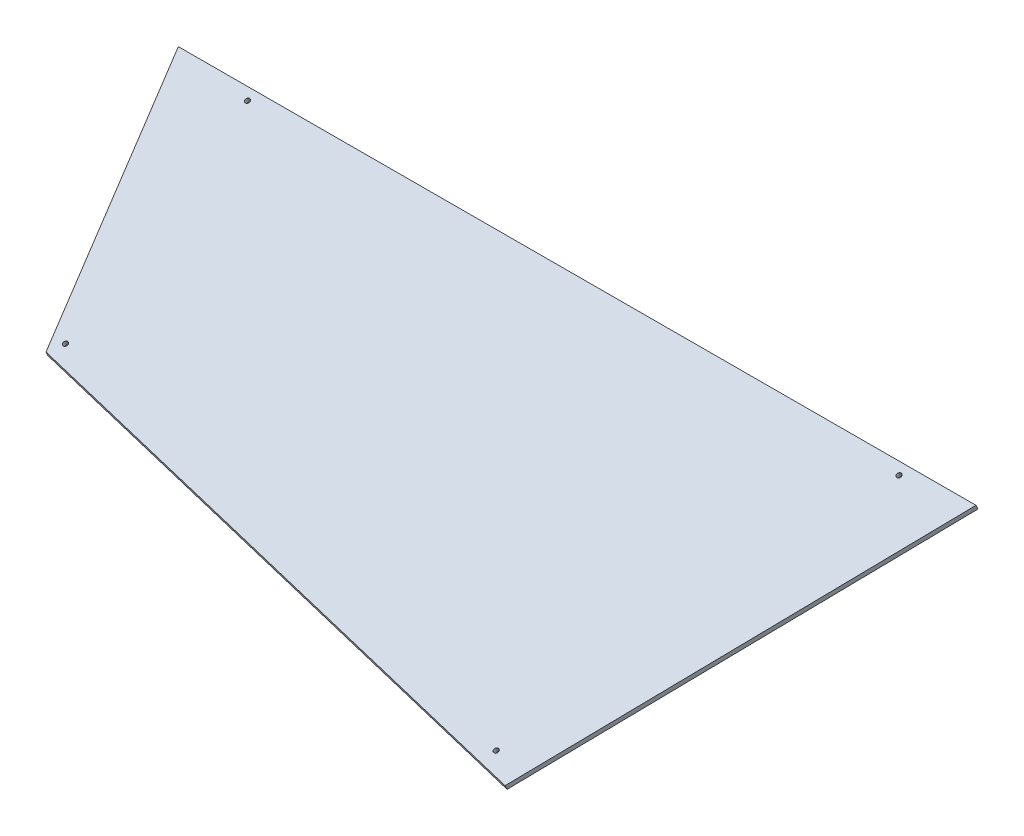
ISO-10303-21;
HEADER;
FILE_DESCRIPTION(('STEP AP214'),'2;1');
FILE_NAME('part.step','',(''),(''),'','','');
FILE_SCHEMA(('AUTOMOTIVE_DESIGN { 1 0 10303 214 1 1 1 1 }'));
ENDSEC;
DATA;
#1=APPLICATION_CONTEXT('core data for automotive mechanical design processes');
#2=APPLICATION_PROTOCOL_DEFINITION('international standard','automotive_design',2000,#1);
#3=PRODUCT_CONTEXT('',#1,'mechanical');
#4=PRODUCT('Part','Part','',(#3));
#5=PRODUCT_RELATED_PRODUCT_CATEGORY('part','',(#4));
#6=PRODUCT_DEFINITION_FORMATION('','',#4);
#7=PRODUCT_DEFINITION_CONTEXT('part definition',#1,'design');
#8=PRODUCT_DEFINITION('design','',#6,#7);
#9=PRODUCT_DEFINITION_SHAPE('','',#8);
#10=(LENGTH_UNIT() NAMED_UNIT(*) SI_UNIT(.MILLI.,.METRE.));
#11=(NAMED_UNIT(*) PLANE_ANGLE_UNIT() SI_UNIT($,.RADIAN.));
#12=(NAMED_UNIT(*) SI_UNIT($,.STERADIAN.) SOLID_ANGLE_UNIT());
#13=UNCERTAINTY_MEASURE_WITH_UNIT(LENGTH_MEASURE(1.E-05),#10,'distance_accuracy_value','');
#14=(GEOMETRIC_REPRESENTATION_CONTEXT(3) GLOBAL_UNCERTAINTY_ASSIGNED_CONTEXT((#13)) GLOBAL_UNIT_ASSIGNED_CONTEXT((#10,
#11,#12)) REPRESENTATION_CONTEXT('',''));
#15=CARTESIAN_POINT('',(0.,0.,0.));
#16=DIRECTION('',(0.,0.,1.));
#17=DIRECTION('',(1.,0.,0.));
#18=AXIS2_PLACEMENT_3D('',#15,#16,#17);
#19=CARTESIAN_POINT('',(-0.00358139259848318,-2107.78023965512,1619.03143783743));
#20=DIRECTION('',(0.00422190853313018,-0.906095441193539,-0.423052274472818));
#21=DIRECTION('',(0.,0.423056044873322,-0.906103516655874));
#22=AXIS2_PLACEMENT_3D('',#19,#20,#21);
#23=PLANE('',#22);
#24=CARTESIAN_POINT('',(-438.261076907726,-2011.60885587052,1408.67744413458));
#25=DIRECTION('',(0.00422190853313018,-0.906095441193539,-0.423052274472818));
#26=DIRECTION('',(0.,0.423056044873322,-0.906103516655874));
#27=AXIS2_PLACEMENT_3D('',#24,#25,#26);
#28=CIRCLE('',#27,3.175);
#29=CARTESIAN_POINT('',(-438.261076907726,-2010.26565292805,1405.8005654692));
#30=VERTEX_POINT('',#29);
#31=EDGE_CURVE('E109',#30,#30,#28,.F.);
#32=ORIENTED_EDGE('',*,*,#31,.T.);
#33=EDGE_LOOP('',(#32));
#34=FACE_BOUND('',#33,.T.);
#35=CARTESIAN_POINT('',(309.868495869838,-2199.30960250355,1818.16188828813));
#36=DIRECTION('',(0.00422190853313018,-0.906095441193539,-0.423052274472818));
#37=DIRECTION('',(0.,0.423056044873322,-0.906103516655874));
#38=AXIS2_PLACEMENT_3D('',#35,#36,#37);
#39=CIRCLE('',#38,3.175);
#40=CARTESIAN_POINT('',(309.868495869838,-2197.96639956107,1815.28500962275));
#41=VERTEX_POINT('',#40);
#42=EDGE_CURVE('E114',#41,#41,#39,.F.);
#43=ORIENTED_EDGE('',*,*,#42,.T.);
#44=EDGE_LOOP('',(#43));
#45=FACE_BOUND('',#44,.T.);
#46=CARTESIAN_POINT('',(-406.222072695858,-2142.2149967263,1688.73005634293));
#47=DIRECTION('',(0.00422190853313018,-0.906095441193539,-0.423052274472818));
#48=DIRECTION('',(0.,0.423056044873322,-0.906103516655874));
#49=AXIS2_PLACEMENT_3D('',#46,#47,#48);
#50=CIRCLE('',#49,3.175);
#51=CARTESIAN_POINT('',(-406.222072695858,-2140.87179378382,1685.85317767755));
#52=VERTEX_POINT('',#51);
#53=EDGE_CURVE('E117',#52,#52,#50,.F.);
#54=ORIENTED_EDGE('',*,*,#53,.T.);
#55=EDGE_LOOP('',(#54));
#56=FACE_BOUND('',#55,.T.);
#57=CARTESIAN_POINT('',(450.723077101153,-2008.20802897601,1410.26527637322));
#58=DIRECTION('',(0.00422190853313018,-0.906095441193539,-0.423052274472818));
#59=DIRECTION('',(0.,0.423056044873322,-0.906103516655874));
#60=AXIS2_PLACEMENT_3D('',#57,#58,#59);
#61=CIRCLE('',#60,3.175);
#62=CARTESIAN_POINT('',(450.723077101153,-2006.86482603354,1407.38839770784));
#63=VERTEX_POINT('',#62);
#64=EDGE_CURVE('E120',#63,#63,#61,.F.);
#65=ORIENTED_EDGE('',*,*,#64,.T.);
#66=EDGE_LOOP('',(#65));
#67=FACE_BOUND('',#66,.T.);
#68=DIRECTION('',(0.981039789113387,-0.0782192678831477,0.177320834388361));
#69=VECTOR('',#68,1.);
#70=CARTESIAN_POINT('',(-417.050544863239,-2149.56653408571,1704.36755096701));
#71=LINE('',#70,#69);
#72=CARTESIAN_POINT('',(346.206371306398,-2210.42175917652,1842.32459891733));
#73=VERTEX_POINT('',#72);
#74=CARTESIAN_POINT('',(-417.044175234292,-2149.5670419425,1704.36870226376));
#75=VERTEX_POINT('',#74);
#76=EDGE_CURVE('E65',#73,#75,#71,.F.);
#77=ORIENTED_EDGE('',*,*,#76,.T.);
#78=DIRECTION('',(0.351213362969676,-0.394761380239892,0.849006847052853));
#79=VECTOR('',#78,1.);
#80=CARTESIAN_POINT('',(-544.203988770672,-2006.6402948557,1396.9784838236));
#81=LINE('',#80,#79);
#82=CARTESIAN_POINT('',(-544.203070163425,-2006.64132736387,1396.98070442203));
#83=VERTEX_POINT('',#82);
#84=EDGE_CURVE('E20',#75,#83,#81,.F.);
#85=ORIENTED_EDGE('',*,*,#84,.T.);
#86=DIRECTION('',(0.999991087704454,0.0038254861688687,0.00178610392584298));
#87=VECTOR('',#86,1.);
#88=CARTESIAN_POINT('',(-0.00358139259848318,-2004.55948119244,1397.95270992817));
#89=LINE('',#88,#87);
#90=CARTESIAN_POINT('',(544.181416145958,-2002.47817600506,1398.92572949959));
#91=VERTEX_POINT('',#90);
#92=EDGE_CURVE('E63',#83,#91,#89,.T.);
#93=ORIENTED_EDGE('',*,*,#92,.T.);
#94=DIRECTION('',(0.374785223744526,0.393653370611545,-0.839388503536315));
#95=VECTOR('',#94,1.);
#96=CARTESIAN_POINT('',(346.205887927682,-2210.42226689041,1842.32568151748));
#97=LINE('',#96,#95);
#98=EDGE_CURVE('E70',#91,#73,#97,.F.);
#99=ORIENTED_EDGE('',*,*,#98,.T.);
#100=EDGE_LOOP('',(#77,#85,#93,#99));
#101=FACE_BOUND('',#100,.T.);
#102=ADVANCED_FACE('F17',(#34,#45,#56,#67,#101),#23,.T.);
#103=CARTESIAN_POINT('',(-470.450893623128,-2083.81468868055,1578.01697448958));
#104=DIRECTION('',(0.936285933441205,0.152166041281801,-0.316566180633302));
#105=DIRECTION('',(-0.320296045935456,0.,-0.947317498496736));
#106=AXIS2_PLACEMENT_3D('',#103,#104,#105);
#107=PLANE('',#106);
#108=DIRECTION('',(0.351213362969675,-0.394761380239891,0.849006847052853));
#109=VECTOR('',#108,1.);
#110=CARTESIAN_POINT('',(-544.228960675439,-2000.88865382032,1399.66930696321));
#111=LINE('',#110,#109);
#112=CARTESIAN_POINT('',(-417.070984353477,-2143.81333589087,1707.05508420669));
#113=VERTEX_POINT('',#112);
#114=CARTESIAN_POINT('',(-544.226382306554,-2000.88812884747,1399.6682083049));
#115=VERTEX_POINT('',#114);
#116=EDGE_CURVE('E102',#113,#115,#111,.F.);
#117=ORIENTED_EDGE('',*,*,#116,.T.);
#118=DIRECTION('',(0.00422190853311099,-0.906095441193552,-0.42305227447279));
#119=VECTOR('',#118,1.);
#120=CARTESIAN_POINT('',(-544.229879282611,-2000.88762131225,1399.66708636496));
#121=LINE('',#120,#119);
#122=EDGE_CURVE('E59',#115,#83,#121,.T.);
#123=ORIENTED_EDGE('',*,*,#122,.T.);
#124=ORIENTED_EDGE('',*,*,#84,.F.);
#125=DIRECTION('',(-0.00422190853308475,0.906095441193522,0.423052274472853));
#126=VECTOR('',#125,1.);
#127=CARTESIAN_POINT('',(-417.070984353477,-2143.81333589088,1707.05508420668));
#128=LINE('',#127,#126);
#129=EDGE_CURVE('E57',#75,#113,#128,.T.);
#130=ORIENTED_EDGE('',*,*,#129,.T.);
#131=EDGE_LOOP('',(#117,#123,#124,#130));
#132=FACE_BOUND('',#131,.T.);
#133=ADVANCED_FACE('F56',(#132),#107,.F.);
#134=CARTESIAN_POINT('',(-36.7692399542864,-1998.94632035387,1400.57347188301));
#135=DIRECTION('',(0.,-0.423056044873294,0.906103516655887));
#136=DIRECTION('',(0.,-0.906103516655887,-0.423056044873294));
#137=AXIS2_PLACEMENT_3D('',#134,#135,#136);
#138=PLANE('',#137);
#139=DIRECTION('',(-0.999991087704454,-0.00382548616886864,-0.00178610392584284));
#140=VECTOR('',#139,1.);
#141=CARTESIAN_POINT('',(544.160305703339,-1996.72396260549,1401.61108167267));
#142=LINE('',#141,#140);
#143=CARTESIAN_POINT('',(544.156699280931,-1996.72397640193,1401.61107523117));
#144=VERTEX_POINT('',#143);
#145=EDGE_CURVE('E91',#115,#144,#142,.F.);
#146=ORIENTED_EDGE('',*,*,#145,.T.);
#147=DIRECTION('',(0.0042219085331533,-0.906095441193552,-0.42305227447279));
#148=VECTOR('',#147,1.);
#149=CARTESIAN_POINT('',(544.156699280931,-1996.72397640199,1401.61107523114));
#150=LINE('',#149,#148);
#151=EDGE_CURVE('E71',#144,#91,#150,.T.);
#152=ORIENTED_EDGE('',*,*,#151,.T.);
#153=ORIENTED_EDGE('',*,*,#92,.F.);
#154=ORIENTED_EDGE('',*,*,#122,.F.);
#155=EDGE_LOOP('',(#146,#152,#153,#154));
#156=FACE_BOUND('',#155,.T.);
#157=ADVANCED_FACE('F89',(#156),#138,.F.);
#158=CARTESIAN_POINT('',(424.551166269604,-2122.3509174624,1669.48585526113));
#159=DIRECTION('',(-0.927102050235627,0.155009919858205,-0.34125315118611));
#160=DIRECTION('',(-0.345428373804897,0.,0.938445117505816));
#161=AXIS2_PLACEMENT_3D('',#158,#159,#160);
#162=PLANE('',#161);
#163=DIRECTION('',(0.374785223744526,0.393653370611546,-0.839388503536315));
#164=VECTOR('',#163,1.);
#165=CARTESIAN_POINT('',(346.180045565917,-2204.66754541103,1845.00989826014));
#166=LINE('',#165,#164);
#167=CARTESIAN_POINT('',(346.179562187212,-2204.66805312489,1845.01098086026));
#168=VERTEX_POINT('',#167);
#169=EDGE_CURVE('E96',#144,#168,#166,.F.);
#170=ORIENTED_EDGE('',*,*,#169,.T.);
#171=DIRECTION('',(0.0042219085331744,-0.906095441193529,-0.423052274472837));
#172=VECTOR('',#171,1.);
#173=CARTESIAN_POINT('',(346.179562187212,-2204.66805312487,1845.01098086027));
#174=LINE('',#173,#172);
#175=EDGE_CURVE('E35',#168,#73,#174,.T.);
#176=ORIENTED_EDGE('',*,*,#175,.T.);
#177=ORIENTED_EDGE('',*,*,#98,.F.);
#178=ORIENTED_EDGE('',*,*,#151,.F.);
#179=EDGE_LOOP('',(#170,#176,#177,#178));
#180=FACE_BOUND('',#179,.T.);
#181=ADVANCED_FACE('F95',(#180),#162,.F.);
#182=CARTESIAN_POINT('',(-28.1216276110646,-2174.82465089115,1777.35684488728));
#183=DIRECTION('',(0.193760438853493,0.415779746476585,-0.888585445950567));
#184=DIRECTION('',(0.,0.905750436995009,0.423811450863883));
#185=AXIS2_PLACEMENT_3D('',#182,#183,#184);
#186=PLANE('',#185);
#187=DIRECTION('',(0.981039789113387,-0.0782192678831483,0.177320834388361));
#188=VECTOR('',#187,1.);
#189=CARTESIAN_POINT('',(-417.064614724072,-2143.81384374769,1707.05623550352));
#190=LINE('',#189,#188);
#191=EDGE_CURVE('E67',#168,#113,#190,.F.);
#192=ORIENTED_EDGE('',*,*,#191,.T.);
#193=ORIENTED_EDGE('',*,*,#129,.F.);
#194=ORIENTED_EDGE('',*,*,#76,.F.);
#195=ORIENTED_EDGE('',*,*,#175,.F.);
#196=EDGE_LOOP('',(#192,#193,#194,#195));
#197=FACE_BOUND('',#196,.T.);
#198=ADVANCED_FACE('F64',(#197),#186,.F.);
#199=CARTESIAN_POINT('',(2782.92716822902,-502540.012145804,-232285.997336627));
#200=DIRECTION('',(0.00422190853313018,-0.906095441193539,-0.423052274472818));
#201=DIRECTION('',(0.,0.423056044873322,-0.906103516655874));
#202=AXIS2_PLACEMENT_3D('',#199,#200,#201);
#203=CYLINDRICAL_SURFACE('',#202,3.175);
#204=CARTESIAN_POINT('',(450.696267981967,-2002.45432292422,1412.95165831622));
#205=DIRECTION('',(0.00422190853313018,-0.906095441193539,-0.423052274472818));
#206=DIRECTION('',(0.,0.423056044873322,-0.906103516655874));
#207=AXIS2_PLACEMENT_3D('',#204,#205,#206);
#208=CIRCLE('',#207,3.175);
#209=CARTESIAN_POINT('',(450.696267981967,-2001.11111998175,1410.07477965083));
#210=VERTEX_POINT('',#209);
#211=EDGE_CURVE('E100',#210,#210,#208,.F.);
#212=ORIENTED_EDGE('',*,*,#211,.T.);
#213=EDGE_LOOP('',(#212));
#214=FACE_BOUND('',#213,.T.);
#215=ORIENTED_EDGE('',*,*,#64,.F.);
#216=EDGE_LOOP('',(#215));
#217=FACE_BOUND('',#216,.T.);
#218=ADVANCED_FACE('F125',(#214,#217),#203,.F.);
#219=CARTESIAN_POINT('',(1925.35761936063,-502540.012147836,-231944.965249655));
#220=DIRECTION('',(0.00422190853313018,-0.906095441193539,-0.423052274472818));
#221=DIRECTION('',(0.,0.423056044873322,-0.906103516655874));
#222=AXIS2_PLACEMENT_3D('',#219,#220,#221);
#223=CYLINDRICAL_SURFACE('',#222,3.175);
#224=CARTESIAN_POINT('',(-406.248881815043,-2136.46129067479,1691.41643828578));
#225=DIRECTION('',(0.00422190853313018,-0.906095441193539,-0.423052274472818));
#226=DIRECTION('',(0.,0.423056044873322,-0.906103516655874));
#227=AXIS2_PLACEMENT_3D('',#224,#225,#226);
#228=CIRCLE('',#227,3.175);
#229=CARTESIAN_POINT('',(-406.248881815043,-2135.11808773231,1688.5395596204));
#230=VERTEX_POINT('',#229);
#231=EDGE_CURVE('E234',#230,#230,#228,.F.);
#232=ORIENTED_EDGE('',*,*,#231,.T.);
#233=EDGE_LOOP('',(#232));
#234=FACE_BOUND('',#233,.T.);
#235=ORIENTED_EDGE('',*,*,#53,.F.);
#236=EDGE_LOOP('',(#235));
#237=FACE_BOUND('',#236,.T.);
#238=ADVANCED_FACE('F127',(#234,#237),#223,.F.);
#239=CARTESIAN_POINT('',(2641.18215833124,-502540.012147836,-231788.876178598));
#240=DIRECTION('',(0.00422190853313018,-0.906095441193539,-0.423052274472818));
#241=DIRECTION('',(0.,0.423056044873322,-0.906103516655874));
#242=AXIS2_PLACEMENT_3D('',#239,#240,#241);
#243=CYLINDRICAL_SURFACE('',#242,3.175);
#244=CARTESIAN_POINT('',(309.841686750653,-2193.5558964521,1820.84827023098));
#245=DIRECTION('',(0.00422190853313018,-0.906095441193539,-0.423052274472818));
#246=DIRECTION('',(0.,0.423056044873322,-0.906103516655874));
#247=AXIS2_PLACEMENT_3D('',#244,#245,#246);
#248=CIRCLE('',#247,3.175);
#249=CARTESIAN_POINT('',(309.841686750653,-2192.21269350962,1817.9713915656));
#250=VERTEX_POINT('',#249);
#251=EDGE_CURVE('E26',#250,#250,#248,.F.);
#252=ORIENTED_EDGE('',*,*,#251,.T.);
#253=EDGE_LOOP('',(#252));
#254=FACE_BOUND('',#253,.T.);
#255=ORIENTED_EDGE('',*,*,#42,.F.);
#256=EDGE_LOOP('',(#255));
#257=FACE_BOUND('',#256,.T.);
#258=ADVANCED_FACE('F135',(#254,#257),#243,.F.);
#259=CARTESIAN_POINT('',(1893.92716822927,-502540.012145804,-232285.997336627));
#260=DIRECTION('',(0.00422190853313018,-0.906095441193539,-0.423052274472818));
#261=DIRECTION('',(0.,0.423056044873322,-0.906103516655874));
#262=AXIS2_PLACEMENT_3D('',#259,#260,#261);
#263=CYLINDRICAL_SURFACE('',#262,3.175);
#264=CARTESIAN_POINT('',(-438.287886026909,-2005.85514981924,1411.36382607735));
#265=DIRECTION('',(0.00422190853313018,-0.906095441193539,-0.423052274472818));
#266=DIRECTION('',(0.,0.423056044873322,-0.906103516655874));
#267=AXIS2_PLACEMENT_3D('',#264,#265,#266);
#268=CIRCLE('',#267,3.175);
#269=CARTESIAN_POINT('',(-438.287886026909,-2004.51194687677,1408.48694741197));
#270=VERTEX_POINT('',#269);
#271=EDGE_CURVE('E11',#270,#270,#268,.F.);
#272=ORIENTED_EDGE('',*,*,#271,.T.);
#273=EDGE_LOOP('',(#272));
#274=FACE_BOUND('',#273,.T.);
#275=ORIENTED_EDGE('',*,*,#31,.F.);
#276=EDGE_LOOP('',(#275));
#277=FACE_BOUND('',#276,.T.);
#278=ADVANCED_FACE('F141',(#274,#277),#263,.F.);
#279=CARTESIAN_POINT('',(-0.0303905117838536,-2102.0265336035,1621.71781978038));
#280=DIRECTION('',(0.00422190853313018,-0.906095441193539,-0.423052274472818));
#281=DIRECTION('',(0.,0.423056044873322,-0.906103516655874));
#282=AXIS2_PLACEMENT_3D('',#279,#280,#281);
#283=PLANE('',#282);
#284=ORIENTED_EDGE('',*,*,#271,.F.);
#285=EDGE_LOOP('',(#284));
#286=FACE_BOUND('',#285,.T.);
#287=ORIENTED_EDGE('',*,*,#251,.F.);
#288=EDGE_LOOP('',(#287));
#289=FACE_BOUND('',#288,.T.);
#290=ORIENTED_EDGE('',*,*,#231,.F.);
#291=EDGE_LOOP('',(#290));
#292=FACE_BOUND('',#291,.T.);
#293=ORIENTED_EDGE('',*,*,#211,.F.);
#294=EDGE_LOOP('',(#293));
#295=FACE_BOUND('',#294,.T.);
#296=ORIENTED_EDGE('',*,*,#169,.F.);
#297=ORIENTED_EDGE('',*,*,#145,.F.);
#298=ORIENTED_EDGE('',*,*,#116,.F.);
#299=ORIENTED_EDGE('',*,*,#191,.F.);
#300=EDGE_LOOP('',(#296,#297,#298,#299));
#301=FACE_BOUND('',#300,.T.);
#302=ADVANCED_FACE('F98',(#286,#289,#292,#295,#301),#283,.F.);
#303=CLOSED_SHELL('',(#102,#133,#157,#181,#198,#218,#238,#258,#278,#302));
#304=MANIFOLD_SOLID_BREP('B1',#303);
#305=ADVANCED_BREP_SHAPE_REPRESENTATION('',(#18,#304),#14);
#306=SHAPE_DEFINITION_REPRESENTATION(#9,#305);
ENDSEC;
END-ISO-10303-21;
